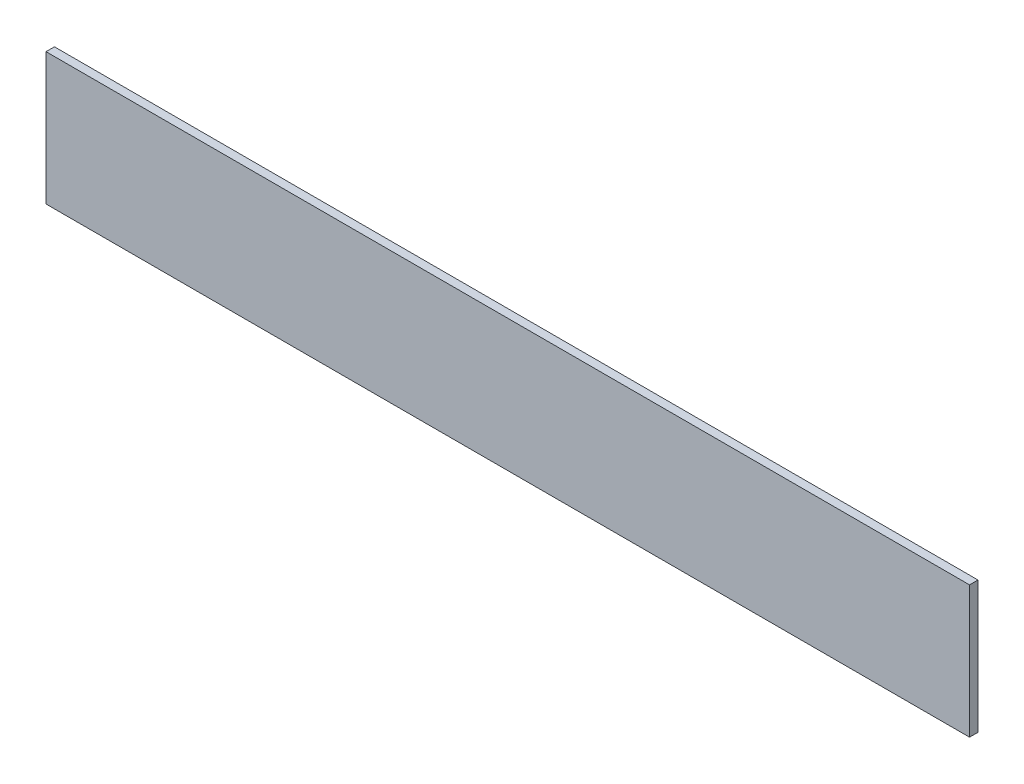
ISO-10303-21;
HEADER;
FILE_DESCRIPTION(('STEP AP214'),'2;1');
FILE_NAME('part.step','',(''),(''),'','','');
FILE_SCHEMA(('AUTOMOTIVE_DESIGN { 1 0 10303 214 1 1 1 1 }'));
ENDSEC;
DATA;
#1=APPLICATION_CONTEXT('core data for automotive mechanical design processes');
#2=APPLICATION_PROTOCOL_DEFINITION('international standard','automotive_design',2000,#1);
#3=PRODUCT_CONTEXT('',#1,'mechanical');
#4=PRODUCT('Part','Part','',(#3));
#5=PRODUCT_RELATED_PRODUCT_CATEGORY('part','',(#4));
#6=PRODUCT_DEFINITION_FORMATION('','',#4);
#7=PRODUCT_DEFINITION_CONTEXT('part definition',#1,'design');
#8=PRODUCT_DEFINITION('design','',#6,#7);
#9=PRODUCT_DEFINITION_SHAPE('','',#8);
#10=(LENGTH_UNIT() NAMED_UNIT(*) SI_UNIT(.MILLI.,.METRE.));
#11=(NAMED_UNIT(*) PLANE_ANGLE_UNIT() SI_UNIT($,.RADIAN.));
#12=(NAMED_UNIT(*) SI_UNIT($,.STERADIAN.) SOLID_ANGLE_UNIT());
#13=UNCERTAINTY_MEASURE_WITH_UNIT(LENGTH_MEASURE(1.E-05),#10,'distance_accuracy_value','');
#14=(GEOMETRIC_REPRESENTATION_CONTEXT(3) GLOBAL_UNCERTAINTY_ASSIGNED_CONTEXT((#13)) GLOBAL_UNIT_ASSIGNED_CONTEXT((#10,
#11,#12)) REPRESENTATION_CONTEXT('',''));
#15=CARTESIAN_POINT('',(0.,0.,0.));
#16=DIRECTION('',(0.,0.,1.));
#17=DIRECTION('',(1.,0.,0.));
#18=AXIS2_PLACEMENT_3D('',#15,#16,#17);
#19=CARTESIAN_POINT('',(87.5,12.5,0.8));
#20=DIRECTION('',(-1.,0.,0.));
#21=DIRECTION('',(0.,-1.,0.));
#22=AXIS2_PLACEMENT_3D('',#19,#20,#21);
#23=PLANE('',#22);
#24=DIRECTION('',(0.,1.,0.));
#25=VECTOR('',#24,1.);
#26=CARTESIAN_POINT('',(87.5,12.5,-0.8));
#27=LINE('',#26,#25);
#28=CARTESIAN_POINT('',(87.5,-12.5,-0.8));
#29=VERTEX_POINT('',#28);
#30=CARTESIAN_POINT('',(87.5,12.5,-0.8));
#31=VERTEX_POINT('',#30);
#32=EDGE_CURVE('E98',#29,#31,#27,.T.);
#33=ORIENTED_EDGE('',*,*,#32,.T.);
#34=DIRECTION('',(0.,0.,-1.));
#35=VECTOR('',#34,1.);
#36=CARTESIAN_POINT('',(87.5,12.5,0.8));
#37=LINE('',#36,#35);
#38=CARTESIAN_POINT('',(87.5,12.5,0.8));
#39=VERTEX_POINT('',#38);
#40=EDGE_CURVE('E11',#39,#31,#37,.T.);
#41=ORIENTED_EDGE('',*,*,#40,.F.);
#42=DIRECTION('',(0.,1.,0.));
#43=VECTOR('',#42,1.);
#44=CARTESIAN_POINT('',(87.5,12.5,0.8));
#45=LINE('',#44,#43);
#46=CARTESIAN_POINT('',(87.5,-12.5,0.8));
#47=VERTEX_POINT('',#46);
#48=EDGE_CURVE('E86',#47,#39,#45,.T.);
#49=ORIENTED_EDGE('',*,*,#48,.F.);
#50=DIRECTION('',(0.,0.,-1.));
#51=VECTOR('',#50,1.);
#52=CARTESIAN_POINT('',(87.5,-12.5,0.8));
#53=LINE('',#52,#51);
#54=EDGE_CURVE('E94',#47,#29,#53,.T.);
#55=ORIENTED_EDGE('',*,*,#54,.T.);
#56=EDGE_LOOP('',(#33,#41,#49,#55));
#57=FACE_BOUND('',#56,.T.);
#58=ADVANCED_FACE('F35',(#57),#23,.F.);
#59=CARTESIAN_POINT('',(-87.5,12.5,0.8));
#60=DIRECTION('',(0.,-1.,0.));
#61=DIRECTION('',(0.,0.,-1.));
#62=AXIS2_PLACEMENT_3D('',#59,#60,#61);
#63=PLANE('',#62);
#64=DIRECTION('',(-1.,0.,0.));
#65=VECTOR('',#64,1.);
#66=CARTESIAN_POINT('',(-87.5,12.5,-0.8));
#67=LINE('',#66,#65);
#68=CARTESIAN_POINT('',(-87.5,12.5,-0.8));
#69=VERTEX_POINT('',#68);
#70=EDGE_CURVE('E90',#31,#69,#67,.T.);
#71=ORIENTED_EDGE('',*,*,#70,.T.);
#72=DIRECTION('',(0.,0.,-1.));
#73=VECTOR('',#72,1.);
#74=CARTESIAN_POINT('',(-87.5,12.5,0.8));
#75=LINE('',#74,#73);
#76=CARTESIAN_POINT('',(-87.5,12.5,0.8));
#77=VERTEX_POINT('',#76);
#78=EDGE_CURVE('E43',#77,#69,#75,.T.);
#79=ORIENTED_EDGE('',*,*,#78,.F.);
#80=DIRECTION('',(-1.,0.,0.));
#81=VECTOR('',#80,1.);
#82=CARTESIAN_POINT('',(-87.5,12.5,0.8));
#83=LINE('',#82,#81);
#84=EDGE_CURVE('E81',#39,#77,#83,.T.);
#85=ORIENTED_EDGE('',*,*,#84,.F.);
#86=ORIENTED_EDGE('',*,*,#40,.T.);
#87=EDGE_LOOP('',(#71,#79,#85,#86));
#88=FACE_BOUND('',#87,.T.);
#89=ADVANCED_FACE('F89',(#88),#63,.F.);
#90=CARTESIAN_POINT('',(-87.5,12.5,0.8));
#91=DIRECTION('',(1.,0.,0.));
#92=DIRECTION('',(0.,1.,0.));
#93=AXIS2_PLACEMENT_3D('',#90,#91,#92);
#94=PLANE('',#93);
#95=DIRECTION('',(0.,-1.,0.));
#96=VECTOR('',#95,1.);
#97=CARTESIAN_POINT('',(-87.5,12.5,-0.8));
#98=LINE('',#97,#96);
#99=CARTESIAN_POINT('',(-87.5,-12.5,-0.8));
#100=VERTEX_POINT('',#99);
#101=EDGE_CURVE('E68',#69,#100,#98,.T.);
#102=ORIENTED_EDGE('',*,*,#101,.T.);
#103=DIRECTION('',(0.,0.,-1.));
#104=VECTOR('',#103,1.);
#105=CARTESIAN_POINT('',(-87.5,-12.5,0.8));
#106=LINE('',#105,#104);
#107=CARTESIAN_POINT('',(-87.5,-12.5,0.8));
#108=VERTEX_POINT('',#107);
#109=EDGE_CURVE('E91',#108,#100,#106,.T.);
#110=ORIENTED_EDGE('',*,*,#109,.F.);
#111=DIRECTION('',(0.,-1.,0.));
#112=VECTOR('',#111,1.);
#113=CARTESIAN_POINT('',(-87.5,12.5,0.8));
#114=LINE('',#113,#112);
#115=EDGE_CURVE('E84',#77,#108,#114,.T.);
#116=ORIENTED_EDGE('',*,*,#115,.F.);
#117=ORIENTED_EDGE('',*,*,#78,.T.);
#118=EDGE_LOOP('',(#102,#110,#116,#117));
#119=FACE_BOUND('',#118,.T.);
#120=ADVANCED_FACE('F92',(#119),#94,.F.);
#121=CARTESIAN_POINT('',(-87.5,-12.5,0.8));
#122=DIRECTION('',(0.,1.,0.));
#123=DIRECTION('',(0.,0.,1.));
#124=AXIS2_PLACEMENT_3D('',#121,#122,#123);
#125=PLANE('',#124);
#126=DIRECTION('',(1.,0.,0.));
#127=VECTOR('',#126,1.);
#128=CARTESIAN_POINT('',(-87.5,-12.5,-0.8));
#129=LINE('',#128,#127);
#130=EDGE_CURVE('E74',#100,#29,#129,.T.);
#131=ORIENTED_EDGE('',*,*,#130,.T.);
#132=ORIENTED_EDGE('',*,*,#54,.F.);
#133=DIRECTION('',(1.,0.,0.));
#134=VECTOR('',#133,1.);
#135=CARTESIAN_POINT('',(-87.5,-12.5,0.8));
#136=LINE('',#135,#134);
#137=EDGE_CURVE('E51',#108,#47,#136,.T.);
#138=ORIENTED_EDGE('',*,*,#137,.F.);
#139=ORIENTED_EDGE('',*,*,#109,.T.);
#140=EDGE_LOOP('',(#131,#132,#138,#139));
#141=FACE_BOUND('',#140,.T.);
#142=ADVANCED_FACE('F105',(#141),#125,.F.);
#143=CARTESIAN_POINT('',(0.,0.,0.8));
#144=DIRECTION('',(0.,0.,1.));
#145=DIRECTION('',(1.,0.,0.));
#146=AXIS2_PLACEMENT_3D('',#143,#144,#145);
#147=PLANE('',#146);
#148=ORIENTED_EDGE('',*,*,#48,.T.);
#149=ORIENTED_EDGE('',*,*,#84,.T.);
#150=ORIENTED_EDGE('',*,*,#115,.T.);
#151=ORIENTED_EDGE('',*,*,#137,.T.);
#152=EDGE_LOOP('',(#148,#149,#150,#151));
#153=FACE_BOUND('',#152,.T.);
#154=ADVANCED_FACE('F82',(#153),#147,.T.);
#155=CARTESIAN_POINT('',(0.,0.,-0.8));
#156=DIRECTION('',(0.,0.,1.));
#157=DIRECTION('',(1.,0.,0.));
#158=AXIS2_PLACEMENT_3D('',#155,#156,#157);
#159=PLANE('',#158);
#160=ORIENTED_EDGE('',*,*,#32,.F.);
#161=ORIENTED_EDGE('',*,*,#130,.F.);
#162=ORIENTED_EDGE('',*,*,#101,.F.);
#163=ORIENTED_EDGE('',*,*,#70,.F.);
#164=EDGE_LOOP('',(#160,#161,#162,#163));
#165=FACE_BOUND('',#164,.T.);
#166=ADVANCED_FACE('F108',(#165),#159,.F.);
#167=CLOSED_SHELL('',(#58,#89,#120,#142,#154,#166));
#168=MANIFOLD_SOLID_BREP('B2',#167);
#169=ADVANCED_BREP_SHAPE_REPRESENTATION('',(#18,#168),#14);
#170=SHAPE_DEFINITION_REPRESENTATION(#9,#169);
ENDSEC;
END-ISO-10303-21;
